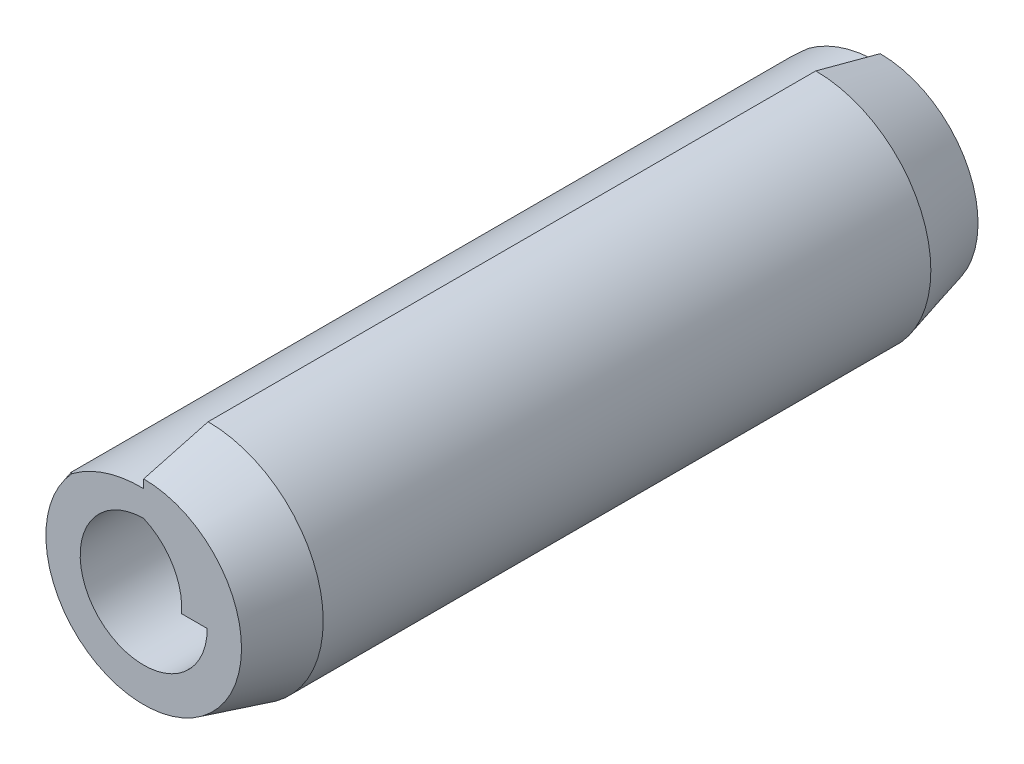
ISO-10303-21;
HEADER;
FILE_DESCRIPTION(('STEP AP214'),'2;1');
FILE_NAME('part.step','',(''),(''),'','','');
FILE_SCHEMA(('AUTOMOTIVE_DESIGN { 1 0 10303 214 1 1 1 1 }'));
ENDSEC;
DATA;
#1=APPLICATION_CONTEXT('core data for automotive mechanical design processes');
#2=APPLICATION_PROTOCOL_DEFINITION('international standard','automotive_design',2000,#1);
#3=PRODUCT_CONTEXT('',#1,'mechanical');
#4=PRODUCT('Part','Part','',(#3));
#5=PRODUCT_RELATED_PRODUCT_CATEGORY('part','',(#4));
#6=PRODUCT_DEFINITION_FORMATION('','',#4);
#7=PRODUCT_DEFINITION_CONTEXT('part definition',#1,'design');
#8=PRODUCT_DEFINITION('design','',#6,#7);
#9=PRODUCT_DEFINITION_SHAPE('','',#8);
#10=(LENGTH_UNIT() NAMED_UNIT(*) SI_UNIT(.MILLI.,.METRE.));
#11=(NAMED_UNIT(*) PLANE_ANGLE_UNIT() SI_UNIT($,.RADIAN.));
#12=(NAMED_UNIT(*) SI_UNIT($,.STERADIAN.) SOLID_ANGLE_UNIT());
#13=UNCERTAINTY_MEASURE_WITH_UNIT(LENGTH_MEASURE(1.E-05),#10,'distance_accuracy_value','');
#14=(GEOMETRIC_REPRESENTATION_CONTEXT(3) GLOBAL_UNCERTAINTY_ASSIGNED_CONTEXT((#13)) GLOBAL_UNIT_ASSIGNED_CONTEXT((#10,
#11,#12)) REPRESENTATION_CONTEXT('',''));
#15=CARTESIAN_POINT('',(0.,0.,0.));
#16=DIRECTION('',(0.,0.,1.));
#17=DIRECTION('',(1.,0.,0.));
#18=AXIS2_PLACEMENT_3D('',#15,#16,#17);
#19=CARTESIAN_POINT('',(0.0357551215937355,-0.0202934993111454,0.));
#20=DIRECTION('',(0.,0.,1.));
#21=DIRECTION('',(1.,0.,0.));
#22=AXIS2_PLACEMENT_3D('',#19,#20,#21);
#23=PLANE('',#22);
#24=CARTESIAN_POINT('',(0.,0.,0.));
#25=DIRECTION('',(0.,0.,-1.));
#26=DIRECTION('',(0.,-1.,0.));
#27=AXIS2_PLACEMENT_3D('',#24,#25,#26);
#28=CIRCLE('',#27,1.06243556529821);
#29=CARTESIAN_POINT('',(0.,1.06243556529821,0.));
#30=VERTEX_POINT('',#29);
#31=CARTESIAN_POINT('',(-0.779140700036146,0.722294330559031,0.));
#32=VERTEX_POINT('',#31);
#33=EDGE_CURVE('E159',#30,#32,#28,.T.);
#34=ORIENTED_EDGE('',*,*,#33,.T.);
#35=CARTESIAN_POINT('',(-0.0316714053720627,-0.279598704417446,0.));
#36=DIRECTION('',(0.,0.,1.));
#37=DIRECTION('',(1.,0.,0.));
#38=AXIS2_PLACEMENT_3D('',#35,#36,#37);
#39=CIRCLE('',#38,1.25);
#40=CARTESIAN_POINT('',(0.,0.97,0.));
#41=VERTEX_POINT('',#40);
#42=EDGE_CURVE('E9',#41,#32,#39,.T.);
#43=ORIENTED_EDGE('',*,*,#42,.F.);
#44=DIRECTION('',(0.,-1.,0.));
#45=VECTOR('',#44,1.);
#46=CARTESIAN_POINT('',(0.,1.25,0.));
#47=LINE('',#46,#45);
#48=EDGE_CURVE('E49',#30,#41,#47,.T.);
#49=ORIENTED_EDGE('',*,*,#48,.F.);
#50=EDGE_LOOP('',(#34,#43,#49));
#51=FACE_BOUND('',#50,.T.);
#52=CARTESIAN_POINT('',(-0.277534614130648,0.058276533632514,0.));
#53=DIRECTION('',(0.,0.,1.));
#54=DIRECTION('',(0.,-1.,0.));
#55=AXIS2_PLACEMENT_3D('',#52,#53,#54);
#56=CIRCLE('',#55,0.69);
#57=CARTESIAN_POINT('',(0.41,0.,0.));
#58=VERTEX_POINT('',#57);
#59=CARTESIAN_POINT('',(0.,0.69,0.));
#60=VERTEX_POINT('',#59);
#61=EDGE_CURVE('E138',#58,#60,#56,.T.);
#62=ORIENTED_EDGE('',*,*,#61,.T.);
#63=CARTESIAN_POINT('',(0.,0.,0.));
#64=DIRECTION('',(0.,0.,1.));
#65=DIRECTION('',(0.,-1.,0.));
#66=AXIS2_PLACEMENT_3D('',#63,#64,#65);
#67=CIRCLE('',#66,0.69);
#68=CARTESIAN_POINT('',(0.69,0.,0.));
#69=VERTEX_POINT('',#68);
#70=EDGE_CURVE('E111',#60,#69,#67,.T.);
#71=ORIENTED_EDGE('',*,*,#70,.T.);
#72=DIRECTION('',(-1.,0.,0.));
#73=VECTOR('',#72,1.);
#74=CARTESIAN_POINT('',(0.292877560796868,0.,0.));
#75=LINE('',#74,#73);
#76=EDGE_CURVE('E101',#69,#58,#75,.T.);
#77=ORIENTED_EDGE('',*,*,#76,.T.);
#78=EDGE_LOOP('',(#62,#71,#77));
#79=FACE_BOUND('',#78,.T.);
#80=ADVANCED_FACE('F15',(#51,#79),#23,.F.);
#81=CARTESIAN_POINT('',(0.0357551215937355,-0.0202934993111454,8.));
#82=DIRECTION('',(0.,0.,1.));
#83=DIRECTION('',(1.,0.,0.));
#84=AXIS2_PLACEMENT_3D('',#81,#82,#83);
#85=PLANE('',#84);
#86=CARTESIAN_POINT('',(0.,0.,8.));
#87=DIRECTION('',(0.,0.,1.));
#88=DIRECTION('',(0.,1.,0.));
#89=AXIS2_PLACEMENT_3D('',#86,#87,#88);
#90=CIRCLE('',#89,1.06243556529821);
#91=CARTESIAN_POINT('',(-0.779140700036146,0.722294330559031,8.));
#92=VERTEX_POINT('',#91);
#93=CARTESIAN_POINT('',(0.,1.06243556529821,8.));
#94=VERTEX_POINT('',#93);
#95=EDGE_CURVE('E155',#92,#94,#90,.T.);
#96=ORIENTED_EDGE('',*,*,#95,.T.);
#97=DIRECTION('',(0.,1.,0.));
#98=VECTOR('',#97,1.);
#99=CARTESIAN_POINT('',(0.,1.25,8.));
#100=LINE('',#99,#98);
#101=CARTESIAN_POINT('',(0.,0.97,8.));
#102=VERTEX_POINT('',#101);
#103=EDGE_CURVE('E149',#102,#94,#100,.T.);
#104=ORIENTED_EDGE('',*,*,#103,.F.);
#105=CARTESIAN_POINT('',(-0.0316714053720627,-0.279598704417446,8.));
#106=DIRECTION('',(0.,0.,-1.));
#107=DIRECTION('',(1.,0.,0.));
#108=AXIS2_PLACEMENT_3D('',#105,#106,#107);
#109=CIRCLE('',#108,1.25);
#110=EDGE_CURVE('E27',#92,#102,#109,.T.);
#111=ORIENTED_EDGE('',*,*,#110,.F.);
#112=EDGE_LOOP('',(#96,#104,#111));
#113=FACE_BOUND('',#112,.T.);
#114=CARTESIAN_POINT('',(-0.277534614130648,0.058276533632514,8.));
#115=DIRECTION('',(0.,0.,-1.));
#116=DIRECTION('',(0.,-1.,0.));
#117=AXIS2_PLACEMENT_3D('',#114,#115,#116);
#118=CIRCLE('',#117,0.69);
#119=CARTESIAN_POINT('',(0.,0.69,8.));
#120=VERTEX_POINT('',#119);
#121=CARTESIAN_POINT('',(0.41,0.,8.));
#122=VERTEX_POINT('',#121);
#123=EDGE_CURVE('E96',#120,#122,#118,.T.);
#124=ORIENTED_EDGE('',*,*,#123,.T.);
#125=DIRECTION('',(1.,0.,0.));
#126=VECTOR('',#125,1.);
#127=CARTESIAN_POINT('',(0.292877560796868,0.,8.));
#128=LINE('',#127,#126);
#129=CARTESIAN_POINT('',(0.69,0.,8.));
#130=VERTEX_POINT('',#129);
#131=EDGE_CURVE('E91',#122,#130,#128,.T.);
#132=ORIENTED_EDGE('',*,*,#131,.T.);
#133=CARTESIAN_POINT('',(0.,0.,8.));
#134=DIRECTION('',(0.,0.,-1.));
#135=DIRECTION('',(0.,-1.,0.));
#136=AXIS2_PLACEMENT_3D('',#133,#134,#135);
#137=CIRCLE('',#136,0.69);
#138=EDGE_CURVE('E95',#130,#120,#137,.T.);
#139=ORIENTED_EDGE('',*,*,#138,.T.);
#140=EDGE_LOOP('',(#124,#132,#139));
#141=FACE_BOUND('',#140,.T.);
#142=ADVANCED_FACE('F93',(#113,#141),#85,.T.);
#143=CARTESIAN_POINT('',(-0.0316714053720627,-0.279598704417446,0.));
#144=DIRECTION('',(0.,0.,-1.));
#145=DIRECTION('',(1.,0.,0.));
#146=AXIS2_PLACEMENT_3D('',#143,#144,#145);
#147=CYLINDRICAL_SURFACE('',#146,1.25);
#148=CARTESIAN_POINT('',(-0.779117242120283,0.722311831073499,4.34794283584796E-05));
#149=CARTESIAN_POINT('',(-0.796776876825579,0.709135430079736,0.0149473369984318));
#150=CARTESIAN_POINT('',(-0.81395466166901,0.695595461630379,0.0300948087094034));
#151=CARTESIAN_POINT('',(-0.848650656810902,0.666759208056817,0.0619749772596702));
#152=CARTESIAN_POINT('',(-0.866093534834101,0.651407922119979,0.0787400248630178));
#153=CARTESIAN_POINT('',(-0.901122161019031,0.61882624053159,0.113853032454877));
#154=CARTESIAN_POINT('',(-0.918628476499272,0.601540032608071,0.132228298410385));
#155=CARTESIAN_POINT('',(-0.953557327621918,0.564976825148333,0.170567890606321));
#156=CARTESIAN_POINT('',(-0.97089530682356,0.545644088566269,0.190556068625015));
#157=CARTESIAN_POINT('',(-1.00523585623315,0.50489244913887,0.23212435308232));
#158=CARTESIAN_POINT('',(-1.02214820827021,0.483418887534461,0.253725317406332));
#159=CARTESIAN_POINT('',(-1.05536150801012,0.438307153242836,0.298521058842904));
#160=CARTESIAN_POINT('',(-1.07156618348161,0.414616210910167,0.321734187661652));
#161=CARTESIAN_POINT('',(-1.09704039401636,0.374502565942105,0.360587200731762));
#162=CARTESIAN_POINT('',(-1.10680877958118,0.358316531604224,0.376147144052689));
#163=CARTESIAN_POINT('',(-1.12742066918698,0.322350945822349,0.41041139768057));
#164=CARTESIAN_POINT('',(-1.1380974592437,0.302491044495627,0.429131916315857));
#165=CARTESIAN_POINT('',(-1.16000575710147,0.258962951025371,0.469720741691987));
#166=CARTESIAN_POINT('',(-1.17103979744183,0.235205526461721,0.491600479275394));
#167=CARTESIAN_POINT('',(-1.18615204614859,0.19980386822773,0.523847950490572));
#168=CARTESIAN_POINT('',(-1.19082608741575,0.188389083180299,0.534192493351808));
#169=CARTESIAN_POINT('',(-1.20279484737355,0.157879977746714,0.561688349614365));
#170=CARTESIAN_POINT('',(-1.20979203409371,0.138671066844205,0.578843084598142));
#171=CARTESIAN_POINT('',(-1.22478330336827,0.0941501259039334,0.618266847874949));
#172=CARTESIAN_POINT('',(-1.23245206669524,0.0687269066482859,0.640534889871858));
#173=CARTESIAN_POINT('',(-1.24312682993786,0.0287758364275327,0.675185778596433));
#174=CARTESIAN_POINT('',(-1.24669415220827,0.0144067691848606,0.687580944301566));
#175=CARTESIAN_POINT('',(-1.25000605662098,-2.63925441707012E-05,0.69996788562761));
#176=B_SPLINE_CURVE_WITH_KNOTS('',3,(#148,#149,#150,#151,#152,#153,#154,#155,#156,#157,#158,
#159,#160,#161,#162,#163,#164,#165,#166,#167,#168,#169,#170,#171,#172,#173,#174,#175),
.UNSPECIFIED.,.F.,.F.,(4,2,2,2,2,2,2,2,2,2,2,2,2,4),(0.,0.0797899467086369,0.165713253063521,
0.257797426365962,0.356064768395621,0.46053358933323,0.57121909016207,0.644660805036946,
0.732554931456975,0.834901754430344,0.883193497113903,0.963237199279336,1.06715953371882,
1.12507869795136),.UNSPECIFIED.);
#177=CARTESIAN_POINT('',(-1.25,0.,0.7));
#178=VERTEX_POINT('',#177);
#179=EDGE_CURVE('E135',#32,#178,#176,.T.);
#180=ORIENTED_EDGE('',*,*,#179,.T.);
#181=DIRECTION('',(0.,0.,1.));
#182=VECTOR('',#181,1.);
#183=CARTESIAN_POINT('',(-1.25,0.,0.));
#184=LINE('',#183,#182);
#185=CARTESIAN_POINT('',(-1.25,0.,7.3));
#186=VERTEX_POINT('',#185);
#187=EDGE_CURVE('E60',#178,#186,#184,.T.);
#188=ORIENTED_EDGE('',*,*,#187,.T.);
#189=CARTESIAN_POINT('',(-1.25000664152571,-2.89414844146336E-05,7.30003547013681));
#190=CARTESIAN_POINT('',(-1.2460703049086,0.0171260255157894,7.31474476370597));
#191=CARTESIAN_POINT('',(-1.2417733042224,0.0341891557391232,7.32946798876962));
#192=CARTESIAN_POINT('',(-1.23012059554872,0.0766582924190991,7.36636223419208));
#193=CARTESIAN_POINT('',(-1.22231518514824,0.101932163033574,7.38854480703826));
#194=CARTESIAN_POINT('',(-1.20947409160553,0.139270393412276,7.42169025377341));
#195=CARTESIAN_POINT('',(-1.20503583482056,0.151546678446631,7.43264978981755));
#196=CARTESIAN_POINT('',(-1.194198042009,0.180116565903425,7.45829687892825));
#197=CARTESIAN_POINT('',(-1.18764543151999,0.196354059831676,7.47298257736056));
#198=CARTESIAN_POINT('',(-1.17048163723945,0.236435670654948,7.50950282345848));
#199=CARTESIAN_POINT('',(-1.15945267760558,0.260116701346285,7.53132150033367));
#200=CARTESIAN_POINT('',(-1.13765508214374,0.303320860962784,7.57162968183448));
#201=CARTESIAN_POINT('',(-1.12709265238253,0.322937640182748,7.59013068948183));
#202=CARTESIAN_POINT('',(-1.10683353240649,0.358261269070161,7.62379538735005));
#203=CARTESIAN_POINT('',(-1.0973092393117,0.37405114638777,7.63897604117205));
#204=CARTESIAN_POINT('',(-1.07211199643204,0.413798225885635,7.67746466163657));
#205=CARTESIAN_POINT('',(-1.0559195561266,0.437511133537353,7.70068786101815));
#206=CARTESIAN_POINT('',(-1.02271780675648,0.482679976768634,7.745518672865));
#207=CARTESIAN_POINT('',(-1.00580379830268,0.504188120014782,7.76714438487174));
#208=CARTESIAN_POINT('',(-0.971443766272389,0.545020887123473,7.80877536459084));
#209=CARTESIAN_POINT('',(-0.954087134462258,0.56439958913798,7.82880127987597));
#210=CARTESIAN_POINT('',(-0.919103173240855,0.601063745988845,7.86723006617544));
#211=CARTESIAN_POINT('',(-0.901559641109691,0.618404452439493,7.88565648133355));
#212=CARTESIAN_POINT('',(-0.866437339395766,0.651101719864509,7.92088539925515));
#213=CARTESIAN_POINT('',(-0.848937304632661,0.666513699681302,7.93771481837485));
#214=CARTESIAN_POINT('',(-0.814107027221418,0.695475486832947,7.96973773605903));
#215=CARTESIAN_POINT('',(-0.796851430159191,0.709080024810836,7.98496303695682));
#216=CARTESIAN_POINT('',(-0.779111063334864,0.722316440544666,7.99994540538178));
#217=B_SPLINE_CURVE_WITH_KNOTS('',3,(#189,#190,#191,#192,#193,#194,#195,#196,#197,#198,#199,
#200,#201,#202,#203,#204,#205,#206,#207,#208,#209,#210,#211,#212,#213,#214,#215,#216),
.UNSPECIFIED.,.F.,.F.,(4,2,2,2,2,2,2,2,2,2,2,2,2,4),(0.,0.068815999730412,0.172335743697925,
0.223465572104428,0.292013221294612,0.394080663058192,0.480935322205523,0.552577319621753,
0.663307715723716,0.767888863865578,0.866335999613755,0.958667431534303,1.04490540047423,
1.12507725642826),.UNSPECIFIED.);
#218=EDGE_CURVE('E166',#186,#92,#217,.T.);
#219=ORIENTED_EDGE('',*,*,#218,.T.);
#220=ORIENTED_EDGE('',*,*,#110,.T.);
#221=DIRECTION('',(0.,0.,1.));
#222=VECTOR('',#221,1.);
#223=CARTESIAN_POINT('',(0.,0.97,0.));
#224=LINE('',#223,#222);
#225=EDGE_CURVE('E145',#41,#102,#224,.T.);
#226=ORIENTED_EDGE('',*,*,#225,.F.);
#227=ORIENTED_EDGE('',*,*,#42,.T.);
#228=EDGE_LOOP('',(#180,#188,#219,#220,#226,#227));
#229=FACE_BOUND('',#228,.T.);
#230=ADVANCED_FACE('F189',(#229),#147,.T.);
#231=CARTESIAN_POINT('',(0.,0.,7.65));
#232=DIRECTION('',(0.,0.,-1.));
#233=DIRECTION('',(0.,1.,0.));
#234=AXIS2_PLACEMENT_3D('',#231,#232,#233);
#235=CONICAL_SURFACE('',#234,1.15621778264911,0.261799387799149);
#236=DIRECTION('',(0.,0.258819045102521,-0.965925826289068));
#237=VECTOR('',#236,1.);
#238=CARTESIAN_POINT('',(0.,1.15621778264911,7.65));
#239=LINE('',#238,#237);
#240=CARTESIAN_POINT('',(0.,1.25,7.3));
#241=VERTEX_POINT('',#240);
#242=EDGE_CURVE('E153',#94,#241,#239,.T.);
#243=ORIENTED_EDGE('',*,*,#242,.F.);
#244=ORIENTED_EDGE('',*,*,#95,.F.);
#245=ORIENTED_EDGE('',*,*,#218,.F.);
#246=CARTESIAN_POINT('',(0.,0.,7.3));
#247=DIRECTION('',(0.,0.,-1.));
#248=DIRECTION('',(1.,0.,0.));
#249=AXIS2_PLACEMENT_3D('',#246,#247,#248);
#250=CIRCLE('',#249,1.25);
#251=EDGE_CURVE('E127',#241,#186,#250,.T.);
#252=ORIENTED_EDGE('',*,*,#251,.F.);
#253=EDGE_LOOP('',(#243,#244,#245,#252));
#254=FACE_BOUND('',#253,.T.);
#255=ADVANCED_FACE('F198',(#254),#235,.T.);
#256=CARTESIAN_POINT('',(0.,1.11,0.));
#257=DIRECTION('',(-1.,0.,0.));
#258=DIRECTION('',(0.,-1.,0.));
#259=AXIS2_PLACEMENT_3D('',#256,#257,#258);
#260=PLANE('',#259);
#261=DIRECTION('',(0.,-0.258819045102521,-0.965925826289068));
#262=VECTOR('',#261,1.);
#263=CARTESIAN_POINT('',(0.,1.15621778264911,0.35));
#264=LINE('',#263,#262);
#265=CARTESIAN_POINT('',(0.,1.25,0.7));
#266=VERTEX_POINT('',#265);
#267=EDGE_CURVE('E121',#266,#30,#264,.T.);
#268=ORIENTED_EDGE('',*,*,#267,.T.);
#269=ORIENTED_EDGE('',*,*,#48,.T.);
#270=ORIENTED_EDGE('',*,*,#225,.T.);
#271=ORIENTED_EDGE('',*,*,#103,.T.);
#272=ORIENTED_EDGE('',*,*,#242,.T.);
#273=DIRECTION('',(0.,0.,1.));
#274=VECTOR('',#273,1.);
#275=CARTESIAN_POINT('',(0.,1.25,0.));
#276=LINE('',#275,#274);
#277=EDGE_CURVE('E123',#266,#241,#276,.T.);
#278=ORIENTED_EDGE('',*,*,#277,.F.);
#279=EDGE_LOOP('',(#268,#269,#270,#271,#272,#278));
#280=FACE_BOUND('',#279,.T.);
#281=ADVANCED_FACE('F234',(#280),#260,.T.);
#282=CARTESIAN_POINT('',(0.,0.,0.));
#283=DIRECTION('',(0.,0.,-1.));
#284=DIRECTION('',(1.,0.,0.));
#285=AXIS2_PLACEMENT_3D('',#282,#283,#284);
#286=CYLINDRICAL_SURFACE('',#285,1.25);
#287=CARTESIAN_POINT('',(0.,0.,0.7));
#288=DIRECTION('',(0.,0.,1.));
#289=DIRECTION('',(1.,0.,0.));
#290=AXIS2_PLACEMENT_3D('',#287,#288,#289);
#291=CIRCLE('',#290,1.25);
#292=EDGE_CURVE('E128',#178,#266,#291,.T.);
#293=ORIENTED_EDGE('',*,*,#292,.T.);
#294=ORIENTED_EDGE('',*,*,#277,.T.);
#295=ORIENTED_EDGE('',*,*,#251,.T.);
#296=ORIENTED_EDGE('',*,*,#187,.F.);
#297=EDGE_LOOP('',(#293,#294,#295,#296));
#298=FACE_BOUND('',#297,.T.);
#299=ADVANCED_FACE('F232',(#298),#286,.T.);
#300=CARTESIAN_POINT('',(0.,0.,0.35));
#301=DIRECTION('',(0.,0.,1.));
#302=DIRECTION('',(0.,-1.,0.));
#303=AXIS2_PLACEMENT_3D('',#300,#301,#302);
#304=CONICAL_SURFACE('',#303,1.15621778264911,0.261799387799149);
#305=ORIENTED_EDGE('',*,*,#179,.F.);
#306=ORIENTED_EDGE('',*,*,#33,.F.);
#307=ORIENTED_EDGE('',*,*,#267,.F.);
#308=ORIENTED_EDGE('',*,*,#292,.F.);
#309=EDGE_LOOP('',(#305,#306,#307,#308));
#310=FACE_BOUND('',#309,.T.);
#311=ADVANCED_FACE('F215',(#310),#304,.T.);
#312=CARTESIAN_POINT('',(0.55,0.,-1.));
#313=DIRECTION('',(0.,1.,0.));
#314=DIRECTION('',(-1.,0.,0.));
#315=AXIS2_PLACEMENT_3D('',#312,#313,#314);
#316=PLANE('',#315);
#317=ORIENTED_EDGE('',*,*,#131,.F.);
#318=DIRECTION('',(0.,0.,1.));
#319=VECTOR('',#318,1.);
#320=CARTESIAN_POINT('',(0.41,0.,-1.));
#321=LINE('',#320,#319);
#322=EDGE_CURVE('E102',#58,#122,#321,.T.);
#323=ORIENTED_EDGE('',*,*,#322,.F.);
#324=ORIENTED_EDGE('',*,*,#76,.F.);
#325=DIRECTION('',(0.,0.,1.));
#326=VECTOR('',#325,1.);
#327=CARTESIAN_POINT('',(0.69,0.,-1.));
#328=LINE('',#327,#326);
#329=EDGE_CURVE('E105',#69,#130,#328,.T.);
#330=ORIENTED_EDGE('',*,*,#329,.T.);
#331=EDGE_LOOP('',(#317,#323,#324,#330));
#332=FACE_BOUND('',#331,.T.);
#333=ADVANCED_FACE('F106',(#332),#316,.F.);
#334=CARTESIAN_POINT('',(-0.277534614130648,0.058276533632514,-1.));
#335=DIRECTION('',(0.,0.,-1.));
#336=DIRECTION('',(0.,-1.,0.));
#337=AXIS2_PLACEMENT_3D('',#334,#335,#336);
#338=CYLINDRICAL_SURFACE('',#337,0.69);
#339=ORIENTED_EDGE('',*,*,#123,.F.);
#340=DIRECTION('',(0.,0.,1.));
#341=VECTOR('',#340,1.);
#342=CARTESIAN_POINT('',(0.,0.69,-1.));
#343=LINE('',#342,#341);
#344=EDGE_CURVE('E116',#60,#120,#343,.T.);
#345=ORIENTED_EDGE('',*,*,#344,.F.);
#346=ORIENTED_EDGE('',*,*,#61,.F.);
#347=ORIENTED_EDGE('',*,*,#322,.T.);
#348=EDGE_LOOP('',(#339,#345,#346,#347));
#349=FACE_BOUND('',#348,.T.);
#350=ADVANCED_FACE('F248',(#349),#338,.F.);
#351=CARTESIAN_POINT('',(0.,0.,-1.));
#352=DIRECTION('',(0.,0.,-1.));
#353=DIRECTION('',(0.,-1.,0.));
#354=AXIS2_PLACEMENT_3D('',#351,#352,#353);
#355=CYLINDRICAL_SURFACE('',#354,0.69);
#356=ORIENTED_EDGE('',*,*,#138,.F.);
#357=ORIENTED_EDGE('',*,*,#329,.F.);
#358=ORIENTED_EDGE('',*,*,#70,.F.);
#359=ORIENTED_EDGE('',*,*,#344,.T.);
#360=EDGE_LOOP('',(#356,#357,#358,#359));
#361=FACE_BOUND('',#360,.T.);
#362=ADVANCED_FACE('F114',(#361),#355,.F.);
#363=CLOSED_SHELL('',(#80,#142,#230,#255,#281,#299,#311,#333,#350,#362));
#364=MANIFOLD_SOLID_BREP('B1',#363);
#365=ADVANCED_BREP_SHAPE_REPRESENTATION('',(#18,#364),#14);
#366=SHAPE_DEFINITION_REPRESENTATION(#9,#365);
ENDSEC;
END-ISO-10303-21;
